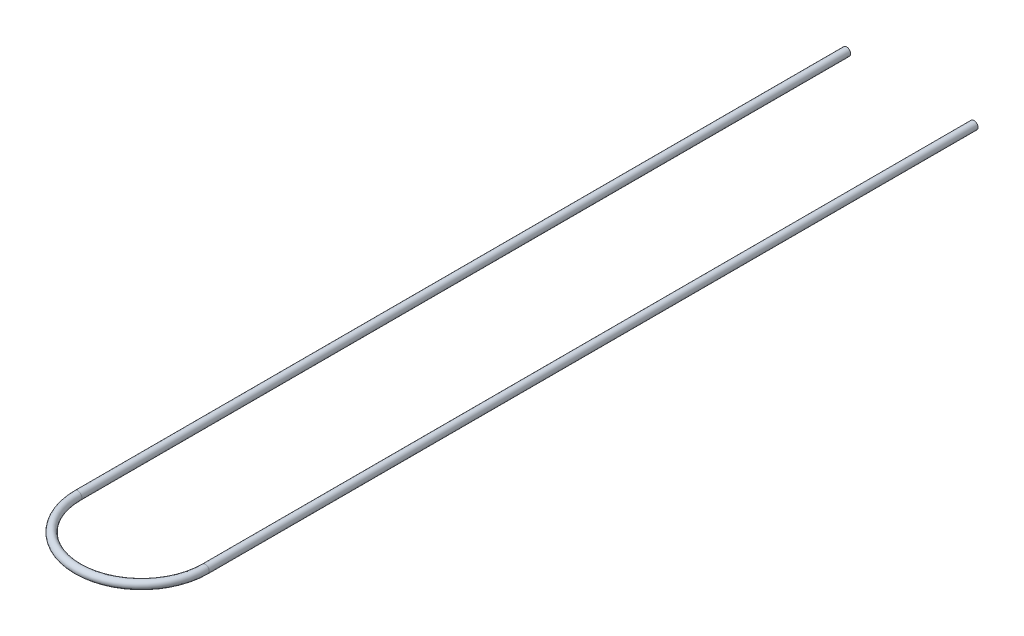
ISO-10303-21;
HEADER;
FILE_DESCRIPTION(('STEP AP214'),'2;1');
FILE_NAME('part.step','',(''),(''),'','','');
FILE_SCHEMA(('AUTOMOTIVE_DESIGN { 1 0 10303 214 1 1 1 1 }'));
ENDSEC;
DATA;
#1=APPLICATION_CONTEXT('core data for automotive mechanical design processes');
#2=APPLICATION_PROTOCOL_DEFINITION('international standard','automotive_design',2000,#1);
#3=PRODUCT_CONTEXT('',#1,'mechanical');
#4=PRODUCT('Part','Part','',(#3));
#5=PRODUCT_RELATED_PRODUCT_CATEGORY('part','',(#4));
#6=PRODUCT_DEFINITION_FORMATION('','',#4);
#7=PRODUCT_DEFINITION_CONTEXT('part definition',#1,'design');
#8=PRODUCT_DEFINITION('design','',#6,#7);
#9=PRODUCT_DEFINITION_SHAPE('','',#8);
#10=(LENGTH_UNIT() NAMED_UNIT(*) SI_UNIT(.MILLI.,.METRE.));
#11=(NAMED_UNIT(*) PLANE_ANGLE_UNIT() SI_UNIT($,.RADIAN.));
#12=(NAMED_UNIT(*) SI_UNIT($,.STERADIAN.) SOLID_ANGLE_UNIT());
#13=UNCERTAINTY_MEASURE_WITH_UNIT(LENGTH_MEASURE(1.E-05),#10,'distance_accuracy_value','');
#14=(GEOMETRIC_REPRESENTATION_CONTEXT(3) GLOBAL_UNCERTAINTY_ASSIGNED_CONTEXT((#13)) GLOBAL_UNIT_ASSIGNED_CONTEXT((#10,
#11,#12)) REPRESENTATION_CONTEXT('',''));
#15=CARTESIAN_POINT('',(0.,0.,0.));
#16=DIRECTION('',(0.,0.,1.));
#17=DIRECTION('',(1.,0.,0.));
#18=AXIS2_PLACEMENT_3D('',#15,#16,#17);
#19=CARTESIAN_POINT('',(-40.,0.,299.999999999999));
#20=DIRECTION('',(0.,0.,1.));
#21=DIRECTION('',(1.,0.,0.));
#22=AXIS2_PLACEMENT_3D('',#19,#20,#21);
#23=CYLINDRICAL_SURFACE('',#22,11.1);
#24=CARTESIAN_POINT('',(-39.9999999999997,0.,2440.));
#25=DIRECTION('',(0.,0.,1.));
#26=DIRECTION('',(1.,0.,0.));
#27=AXIS2_PLACEMENT_3D('',#24,#25,#26);
#28=CIRCLE('',#27,11.1);
#29=CARTESIAN_POINT('',(-51.0999999999997,0.,2440.));
#30=VERTEX_POINT('',#29);
#31=EDGE_CURVE('E54',#30,#30,#28,.T.);
#32=ORIENTED_EDGE('',*,*,#31,.F.);
#33=EDGE_LOOP('',(#32));
#34=FACE_BOUND('',#33,.T.);
#35=CARTESIAN_POINT('',(-40.,0.,299.999999999999));
#36=DIRECTION('',(0.,0.,1.));
#37=DIRECTION('',(1.,0.,0.));
#38=AXIS2_PLACEMENT_3D('',#35,#36,#37);
#39=CIRCLE('',#38,11.1);
#40=CARTESIAN_POINT('',(-28.9,0.,299.999999999999));
#41=VERTEX_POINT('',#40);
#42=EDGE_CURVE('E52',#41,#41,#39,.T.);
#43=ORIENTED_EDGE('',*,*,#42,.T.);
#44=EDGE_LOOP('',(#43));
#45=FACE_BOUND('',#44,.T.);
#46=ADVANCED_FACE('F31',(#34,#45),#23,.T.);
#47=CARTESIAN_POINT('',(137.35,0.,2440.));
#48=DIRECTION('',(0.,1.,0.));
#49=DIRECTION('',(0.,0.,1.));
#50=AXIS2_PLACEMENT_3D('',#47,#48,#49);
#51=TOROIDAL_SURFACE('',#50,177.35,11.1);
#52=CARTESIAN_POINT('',(314.7,0.,2440.));
#53=DIRECTION('',(0.,0.,-1.));
#54=DIRECTION('',(-1.,0.,0.));
#55=AXIS2_PLACEMENT_3D('',#52,#53,#54);
#56=CIRCLE('',#55,11.1);
#57=CARTESIAN_POINT('',(325.8,0.,2440.));
#58=VERTEX_POINT('',#57);
#59=EDGE_CURVE('E35',#58,#58,#56,.T.);
#60=CARTESIAN_POINT('',(137.35,0.,2440.));
#61=DIRECTION('',(0.,1.,0.));
#62=DIRECTION('',(0.,0.,1.));
#63=AXIS2_PLACEMENT_3D('',#60,#61,#62);
#64=CIRCLE('',#63,188.45);
#65=EDGE_CURVE('',#30,#58,#64,.T.);
#66=ORIENTED_EDGE('',*,*,#31,.T.);
#67=ORIENTED_EDGE('',*,*,#59,.F.);
#68=ORIENTED_EDGE('',*,*,#65,.T.);
#69=ORIENTED_EDGE('',*,*,#65,.F.);
#70=EDGE_LOOP('',(#66,#68,#67,#69));
#71=FACE_BOUND('',#70,.T.);
#72=ADVANCED_FACE('F62',(#71),#51,.T.);
#73=CARTESIAN_POINT('',(314.7,0.,2440.));
#74=DIRECTION('',(0.,0.,-1.));
#75=DIRECTION('',(-1.,0.,0.));
#76=AXIS2_PLACEMENT_3D('',#73,#74,#75);
#77=CYLINDRICAL_SURFACE('',#76,11.1);
#78=CARTESIAN_POINT('',(314.7,0.,299.999999999999));
#79=DIRECTION('',(0.,0.,-1.));
#80=DIRECTION('',(-1.,0.,0.));
#81=AXIS2_PLACEMENT_3D('',#78,#79,#80);
#82=CIRCLE('',#81,11.1);
#83=CARTESIAN_POINT('',(303.6,0.,299.999999999999));
#84=VERTEX_POINT('',#83);
#85=EDGE_CURVE('E48',#84,#84,#82,.T.);
#86=ORIENTED_EDGE('',*,*,#85,.F.);
#87=EDGE_LOOP('',(#86));
#88=FACE_BOUND('',#87,.T.);
#89=ORIENTED_EDGE('',*,*,#59,.T.);
#90=EDGE_LOOP('',(#89));
#91=FACE_BOUND('',#90,.T.);
#92=ADVANCED_FACE('F33',(#88,#91),#77,.T.);
#93=CARTESIAN_POINT('',(-40.,0.,299.999999999999));
#94=DIRECTION('',(0.,0.,1.));
#95=DIRECTION('',(1.,0.,0.));
#96=AXIS2_PLACEMENT_3D('',#93,#94,#95);
#97=PLANE('',#96);
#98=CARTESIAN_POINT('',(-40.,0.,299.999999999999));
#99=DIRECTION('',(0.,0.,1.));
#100=DIRECTION('',(1.,0.,0.));
#101=AXIS2_PLACEMENT_3D('',#98,#99,#100);
#102=CIRCLE('',#101,9.95000000000001);
#103=CARTESIAN_POINT('',(-30.05,0.,299.999999999999));
#104=VERTEX_POINT('',#103);
#105=EDGE_CURVE('E51',#104,#104,#102,.F.);
#106=ORIENTED_EDGE('',*,*,#105,.F.);
#107=EDGE_LOOP('',(#106));
#108=FACE_BOUND('',#107,.T.);
#109=ORIENTED_EDGE('',*,*,#42,.F.);
#110=EDGE_LOOP('',(#109));
#111=FACE_BOUND('',#110,.T.);
#112=ADVANCED_FACE('F68',(#108,#111),#97,.F.);
#113=CARTESIAN_POINT('',(314.7,0.,299.999999999999));
#114=DIRECTION('',(0.,0.,-1.));
#115=DIRECTION('',(-1.,0.,0.));
#116=AXIS2_PLACEMENT_3D('',#113,#114,#115);
#117=PLANE('',#116);
#118=CARTESIAN_POINT('',(314.7,0.,299.999999999999));
#119=DIRECTION('',(0.,0.,-1.));
#120=DIRECTION('',(-1.,0.,0.));
#121=AXIS2_PLACEMENT_3D('',#118,#119,#120);
#122=CIRCLE('',#121,9.95000000000001);
#123=CARTESIAN_POINT('',(304.75,0.,299.999999999999));
#124=VERTEX_POINT('',#123);
#125=EDGE_CURVE('E10',#124,#124,#122,.F.);
#126=ORIENTED_EDGE('',*,*,#125,.T.);
#127=EDGE_LOOP('',(#126));
#128=FACE_BOUND('',#127,.T.);
#129=ORIENTED_EDGE('',*,*,#85,.T.);
#130=EDGE_LOOP('',(#129));
#131=FACE_BOUND('',#130,.T.);
#132=ADVANCED_FACE('F86',(#128,#131),#117,.T.);
#133=CARTESIAN_POINT('',(-40.,0.,299.999999999999));
#134=DIRECTION('',(0.,0.,1.));
#135=DIRECTION('',(1.,0.,0.));
#136=AXIS2_PLACEMENT_3D('',#133,#134,#135);
#137=CYLINDRICAL_SURFACE('',#136,9.95000000000001);
#138=CARTESIAN_POINT('',(-39.9999999999997,0.,2440.));
#139=DIRECTION('',(0.,0.,1.));
#140=DIRECTION('',(1.,0.,0.));
#141=AXIS2_PLACEMENT_3D('',#138,#139,#140);
#142=CIRCLE('',#141,9.95000000000001);
#143=CARTESIAN_POINT('',(-49.9499999999998,0.,2440.));
#144=VERTEX_POINT('',#143);
#145=EDGE_CURVE('E44',#144,#144,#142,.F.);
#146=ORIENTED_EDGE('',*,*,#145,.F.);
#147=EDGE_LOOP('',(#146));
#148=FACE_BOUND('',#147,.T.);
#149=ORIENTED_EDGE('',*,*,#105,.T.);
#150=EDGE_LOOP('',(#149));
#151=FACE_BOUND('',#150,.T.);
#152=ADVANCED_FACE('F80',(#148,#151),#137,.F.);
#153=CARTESIAN_POINT('',(137.35,0.,2440.));
#154=DIRECTION('',(0.,1.,0.));
#155=DIRECTION('',(0.,0.,1.));
#156=AXIS2_PLACEMENT_3D('',#153,#154,#155);
#157=TOROIDAL_SURFACE('',#156,177.35,9.95000000000001);
#158=CARTESIAN_POINT('',(314.7,0.,2440.));
#159=DIRECTION('',(0.,0.,-1.));
#160=DIRECTION('',(-1.,0.,0.));
#161=AXIS2_PLACEMENT_3D('',#158,#159,#160);
#162=CIRCLE('',#161,9.95000000000001);
#163=CARTESIAN_POINT('',(324.65,0.,2440.));
#164=VERTEX_POINT('',#163);
#165=EDGE_CURVE('E39',#164,#164,#162,.F.);
#166=CARTESIAN_POINT('',(137.35,0.,2440.));
#167=DIRECTION('',(0.,1.,0.));
#168=DIRECTION('',(0.,0.,1.));
#169=AXIS2_PLACEMENT_3D('',#166,#167,#168);
#170=CIRCLE('',#169,187.3);
#171=EDGE_CURVE('',#144,#164,#170,.T.);
#172=ORIENTED_EDGE('',*,*,#145,.T.);
#173=ORIENTED_EDGE('',*,*,#165,.F.);
#174=ORIENTED_EDGE('',*,*,#171,.T.);
#175=ORIENTED_EDGE('',*,*,#171,.F.);
#176=EDGE_LOOP('',(#172,#174,#173,#175));
#177=FACE_BOUND('',#176,.T.);
#178=ADVANCED_FACE('F74',(#177),#157,.F.);
#179=CARTESIAN_POINT('',(314.7,0.,2440.));
#180=DIRECTION('',(0.,0.,-1.));
#181=DIRECTION('',(-1.,0.,0.));
#182=AXIS2_PLACEMENT_3D('',#179,#180,#181);
#183=CYLINDRICAL_SURFACE('',#182,9.95000000000001);
#184=ORIENTED_EDGE('',*,*,#125,.F.);
#185=EDGE_LOOP('',(#184));
#186=FACE_BOUND('',#185,.T.);
#187=ORIENTED_EDGE('',*,*,#165,.T.);
#188=EDGE_LOOP('',(#187));
#189=FACE_BOUND('',#188,.T.);
#190=ADVANCED_FACE('F72',(#186,#189),#183,.F.);
#191=CLOSED_SHELL('',(#46,#72,#92,#112,#132,#152,#178,#190));
#192=MANIFOLD_SOLID_BREP('B2',#191);
#193=ADVANCED_BREP_SHAPE_REPRESENTATION('',(#18,#192),#14);
#194=SHAPE_DEFINITION_REPRESENTATION(#9,#193);
ENDSEC;
END-ISO-10303-21;
